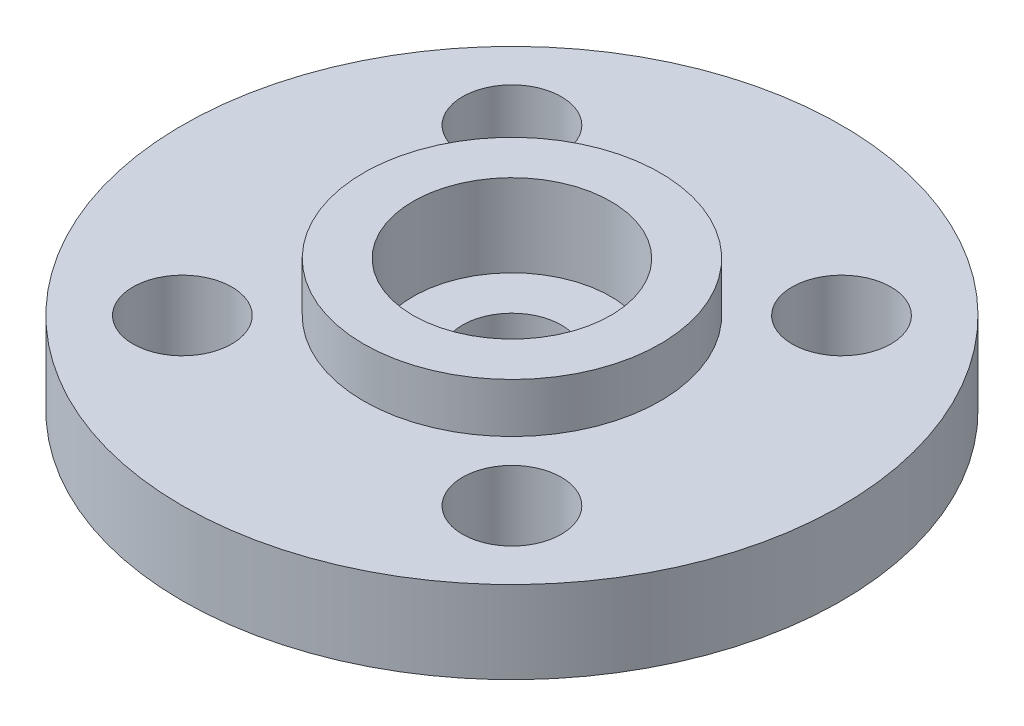
ISO-10303-21;
HEADER;
FILE_DESCRIPTION(('STEP AP214'),'2;1');
FILE_NAME('part.step','',(''),(''),'','','');
FILE_SCHEMA(('AUTOMOTIVE_DESIGN { 1 0 10303 214 1 1 1 1 }'));
ENDSEC;
DATA;
#1=APPLICATION_CONTEXT('core data for automotive mechanical design processes');
#2=APPLICATION_PROTOCOL_DEFINITION('international standard','automotive_design',2000,#1);
#3=PRODUCT_CONTEXT('',#1,'mechanical');
#4=PRODUCT('Part','Part','',(#3));
#5=PRODUCT_RELATED_PRODUCT_CATEGORY('part','',(#4));
#6=PRODUCT_DEFINITION_FORMATION('','',#4);
#7=PRODUCT_DEFINITION_CONTEXT('part definition',#1,'design');
#8=PRODUCT_DEFINITION('design','',#6,#7);
#9=PRODUCT_DEFINITION_SHAPE('','',#8);
#10=(LENGTH_UNIT() NAMED_UNIT(*) SI_UNIT(.MILLI.,.METRE.));
#11=(NAMED_UNIT(*) PLANE_ANGLE_UNIT() SI_UNIT($,.RADIAN.));
#12=(NAMED_UNIT(*) SI_UNIT($,.STERADIAN.) SOLID_ANGLE_UNIT());
#13=UNCERTAINTY_MEASURE_WITH_UNIT(LENGTH_MEASURE(1.E-05),#10,'distance_accuracy_value','');
#14=(GEOMETRIC_REPRESENTATION_CONTEXT(3) GLOBAL_UNCERTAINTY_ASSIGNED_CONTEXT((#13)) GLOBAL_UNIT_ASSIGNED_CONTEXT((#10,
#11,#12)) REPRESENTATION_CONTEXT('',''));
#15=CARTESIAN_POINT('',(0.,0.,0.));
#16=DIRECTION('',(0.,0.,1.));
#17=DIRECTION('',(1.,0.,0.));
#18=AXIS2_PLACEMENT_3D('',#15,#16,#17);
#19=CARTESIAN_POINT('',(0.,2.5,0.));
#20=DIRECTION('',(0.,1.,0.));
#21=DIRECTION('',(0.,0.,1.));
#22=AXIS2_PLACEMENT_3D('',#19,#20,#21);
#23=PLANE('',#22);
#24=CARTESIAN_POINT('',(0.,2.5,0.));
#25=DIRECTION('',(0.,1.,0.));
#26=DIRECTION('',(0.,0.,1.));
#27=AXIS2_PLACEMENT_3D('',#24,#25,#26);
#28=CIRCLE('',#27,10.);
#29=CARTESIAN_POINT('',(0.,2.5,10.));
#30=VERTEX_POINT('',#29);
#31=EDGE_CURVE('E11',#30,#30,#28,.T.);
#32=ORIENTED_EDGE('',*,*,#31,.T.);
#33=EDGE_LOOP('',(#32));
#34=FACE_BOUND('',#33,.T.);
#35=CARTESIAN_POINT('',(4.99999999999997,2.5,5.00000000000003));
#36=DIRECTION('',(0.,1.,0.));
#37=DIRECTION('',(0.,0.,1.));
#38=AXIS2_PLACEMENT_3D('',#35,#36,#37);
#39=CIRCLE('',#38,1.5);
#40=CARTESIAN_POINT('',(4.99999999999997,2.5,6.50000000000003));
#41=VERTEX_POINT('',#40);
#42=EDGE_CURVE('E58',#41,#41,#39,.T.);
#43=ORIENTED_EDGE('',*,*,#42,.F.);
#44=EDGE_LOOP('',(#43));
#45=FACE_BOUND('',#44,.T.);
#46=CARTESIAN_POINT('',(-5.00000000000005,2.5,4.99999999999995));
#47=DIRECTION('',(0.,1.,0.));
#48=DIRECTION('',(0.,0.,1.));
#49=AXIS2_PLACEMENT_3D('',#46,#47,#48);
#50=CIRCLE('',#49,1.5);
#51=CARTESIAN_POINT('',(-5.00000000000005,2.5,6.49999999999995));
#52=VERTEX_POINT('',#51);
#53=EDGE_CURVE('E64',#52,#52,#50,.T.);
#54=ORIENTED_EDGE('',*,*,#53,.F.);
#55=EDGE_LOOP('',(#54));
#56=FACE_BOUND('',#55,.T.);
#57=CARTESIAN_POINT('',(5.00000000000002,2.5,-4.99999999999999));
#58=DIRECTION('',(0.,1.,0.));
#59=DIRECTION('',(0.,0.,1.));
#60=AXIS2_PLACEMENT_3D('',#57,#58,#59);
#61=CIRCLE('',#60,1.5);
#62=CARTESIAN_POINT('',(5.00000000000002,2.5,-3.49999999999998));
#63=VERTEX_POINT('',#62);
#64=EDGE_CURVE('E92',#63,#63,#61,.T.);
#65=ORIENTED_EDGE('',*,*,#64,.F.);
#66=EDGE_LOOP('',(#65));
#67=FACE_BOUND('',#66,.T.);
#68=CARTESIAN_POINT('',(-5.,2.5,-5.));
#69=DIRECTION('',(0.,1.,0.));
#70=DIRECTION('',(0.,0.,1.));
#71=AXIS2_PLACEMENT_3D('',#68,#69,#70);
#72=CIRCLE('',#71,1.5);
#73=CARTESIAN_POINT('',(-5.,2.5,-3.5));
#74=VERTEX_POINT('',#73);
#75=EDGE_CURVE('E87',#74,#74,#72,.T.);
#76=ORIENTED_EDGE('',*,*,#75,.F.);
#77=EDGE_LOOP('',(#76));
#78=FACE_BOUND('',#77,.T.);
#79=CARTESIAN_POINT('',(0.,2.5,0.));
#80=DIRECTION('',(0.,1.,0.));
#81=DIRECTION('',(0.,0.,1.));
#82=AXIS2_PLACEMENT_3D('',#79,#80,#81);
#83=CIRCLE('',#82,4.5);
#84=CARTESIAN_POINT('',(0.,2.5,4.5));
#85=VERTEX_POINT('',#84);
#86=EDGE_CURVE('E117',#85,#85,#83,.T.);
#87=ORIENTED_EDGE('',*,*,#86,.F.);
#88=EDGE_LOOP('',(#87));
#89=FACE_BOUND('',#88,.T.);
#90=ADVANCED_FACE('F49',(#34,#45,#56,#67,#78,#89),#23,.T.);
#91=CARTESIAN_POINT('',(0.,2.5,0.));
#92=DIRECTION('',(0.,-1.,0.));
#93=DIRECTION('',(0.,0.,-1.));
#94=AXIS2_PLACEMENT_3D('',#91,#92,#93);
#95=CYLINDRICAL_SURFACE('',#94,10.);
#96=ORIENTED_EDGE('',*,*,#31,.F.);
#97=EDGE_LOOP('',(#96));
#98=FACE_BOUND('',#97,.T.);
#99=CARTESIAN_POINT('',(0.,0.,0.));
#100=DIRECTION('',(0.,1.,0.));
#101=DIRECTION('',(0.,0.,1.));
#102=AXIS2_PLACEMENT_3D('',#99,#100,#101);
#103=CIRCLE('',#102,10.);
#104=CARTESIAN_POINT('',(0.,0.,10.));
#105=VERTEX_POINT('',#104);
#106=EDGE_CURVE('E53',#105,#105,#103,.T.);
#107=ORIENTED_EDGE('',*,*,#106,.T.);
#108=EDGE_LOOP('',(#107));
#109=FACE_BOUND('',#108,.T.);
#110=ADVANCED_FACE('F110',(#98,#109),#95,.T.);
#111=CARTESIAN_POINT('',(4.99999999999997,2.5,5.00000000000003));
#112=DIRECTION('',(0.,-1.,0.));
#113=DIRECTION('',(0.,0.,-1.));
#114=AXIS2_PLACEMENT_3D('',#111,#112,#113);
#115=CYLINDRICAL_SURFACE('',#114,1.5);
#116=ORIENTED_EDGE('',*,*,#42,.T.);
#117=EDGE_LOOP('',(#116));
#118=FACE_BOUND('',#117,.T.);
#119=CARTESIAN_POINT('',(4.99999999999997,0.,5.00000000000003));
#120=DIRECTION('',(0.,1.,0.));
#121=DIRECTION('',(0.,0.,1.));
#122=AXIS2_PLACEMENT_3D('',#119,#120,#121);
#123=CIRCLE('',#122,1.5);
#124=CARTESIAN_POINT('',(4.99999999999997,0.,6.50000000000003));
#125=VERTEX_POINT('',#124);
#126=EDGE_CURVE('E80',#125,#125,#123,.T.);
#127=ORIENTED_EDGE('',*,*,#126,.F.);
#128=EDGE_LOOP('',(#127));
#129=FACE_BOUND('',#128,.T.);
#130=ADVANCED_FACE('F174',(#118,#129),#115,.F.);
#131=CARTESIAN_POINT('',(-5.00000000000005,2.5,4.99999999999995));
#132=DIRECTION('',(0.,-1.,0.));
#133=DIRECTION('',(0.,0.,-1.));
#134=AXIS2_PLACEMENT_3D('',#131,#132,#133);
#135=CYLINDRICAL_SURFACE('',#134,1.5);
#136=ORIENTED_EDGE('',*,*,#53,.T.);
#137=EDGE_LOOP('',(#136));
#138=FACE_BOUND('',#137,.T.);
#139=CARTESIAN_POINT('',(-5.00000000000005,0.,4.99999999999995));
#140=DIRECTION('',(0.,1.,0.));
#141=DIRECTION('',(0.,0.,1.));
#142=AXIS2_PLACEMENT_3D('',#139,#140,#141);
#143=CIRCLE('',#142,1.5);
#144=CARTESIAN_POINT('',(-5.00000000000005,0.,6.49999999999995));
#145=VERTEX_POINT('',#144);
#146=EDGE_CURVE('E77',#145,#145,#143,.T.);
#147=ORIENTED_EDGE('',*,*,#146,.F.);
#148=EDGE_LOOP('',(#147));
#149=FACE_BOUND('',#148,.T.);
#150=ADVANCED_FACE('F105',(#138,#149),#135,.F.);
#151=CARTESIAN_POINT('',(5.00000000000002,2.5,-4.99999999999999));
#152=DIRECTION('',(0.,-1.,0.));
#153=DIRECTION('',(0.,0.,-1.));
#154=AXIS2_PLACEMENT_3D('',#151,#152,#153);
#155=CYLINDRICAL_SURFACE('',#154,1.5);
#156=ORIENTED_EDGE('',*,*,#64,.T.);
#157=EDGE_LOOP('',(#156));
#158=FACE_BOUND('',#157,.T.);
#159=CARTESIAN_POINT('',(5.00000000000002,0.,-4.99999999999999));
#160=DIRECTION('',(0.,1.,0.));
#161=DIRECTION('',(0.,0.,1.));
#162=AXIS2_PLACEMENT_3D('',#159,#160,#161);
#163=CIRCLE('',#162,1.5);
#164=CARTESIAN_POINT('',(5.00000000000002,0.,-3.49999999999998));
#165=VERTEX_POINT('',#164);
#166=EDGE_CURVE('E72',#165,#165,#163,.T.);
#167=ORIENTED_EDGE('',*,*,#166,.F.);
#168=EDGE_LOOP('',(#167));
#169=FACE_BOUND('',#168,.T.);
#170=ADVANCED_FACE('F180',(#158,#169),#155,.F.);
#171=CARTESIAN_POINT('',(-5.,2.5,-5.));
#172=DIRECTION('',(0.,-1.,0.));
#173=DIRECTION('',(0.,0.,-1.));
#174=AXIS2_PLACEMENT_3D('',#171,#172,#173);
#175=CYLINDRICAL_SURFACE('',#174,1.5);
#176=ORIENTED_EDGE('',*,*,#75,.T.);
#177=EDGE_LOOP('',(#176));
#178=FACE_BOUND('',#177,.T.);
#179=CARTESIAN_POINT('',(-5.,0.,-5.));
#180=DIRECTION('',(0.,1.,0.));
#181=DIRECTION('',(0.,0.,1.));
#182=AXIS2_PLACEMENT_3D('',#179,#180,#181);
#183=CIRCLE('',#182,1.5);
#184=CARTESIAN_POINT('',(-5.,0.,-3.5));
#185=VERTEX_POINT('',#184);
#186=EDGE_CURVE('E68',#185,#185,#183,.T.);
#187=ORIENTED_EDGE('',*,*,#186,.F.);
#188=EDGE_LOOP('',(#187));
#189=FACE_BOUND('',#188,.T.);
#190=ADVANCED_FACE('F51',(#178,#189),#175,.F.);
#191=CARTESIAN_POINT('',(0.,0.,0.));
#192=DIRECTION('',(0.,1.,0.));
#193=DIRECTION('',(0.,0.,1.));
#194=AXIS2_PLACEMENT_3D('',#191,#192,#193);
#195=PLANE('',#194);
#196=CARTESIAN_POINT('',(0.,0.,0.));
#197=DIRECTION('',(0.,1.,0.));
#198=DIRECTION('',(0.,0.,1.));
#199=AXIS2_PLACEMENT_3D('',#196,#197,#198);
#200=CIRCLE('',#199,1.5);
#201=CARTESIAN_POINT('',(0.,0.,1.5));
#202=VERTEX_POINT('',#201);
#203=EDGE_CURVE('E131',#202,#202,#200,.T.);
#204=ORIENTED_EDGE('',*,*,#203,.T.);
#205=EDGE_LOOP('',(#204));
#206=FACE_BOUND('',#205,.T.);
#207=ORIENTED_EDGE('',*,*,#186,.T.);
#208=EDGE_LOOP('',(#207));
#209=FACE_BOUND('',#208,.T.);
#210=ORIENTED_EDGE('',*,*,#166,.T.);
#211=EDGE_LOOP('',(#210));
#212=FACE_BOUND('',#211,.T.);
#213=ORIENTED_EDGE('',*,*,#146,.T.);
#214=EDGE_LOOP('',(#213));
#215=FACE_BOUND('',#214,.T.);
#216=ORIENTED_EDGE('',*,*,#126,.T.);
#217=EDGE_LOOP('',(#216));
#218=FACE_BOUND('',#217,.T.);
#219=ORIENTED_EDGE('',*,*,#106,.F.);
#220=EDGE_LOOP('',(#219));
#221=FACE_BOUND('',#220,.T.);
#222=ADVANCED_FACE('F151',(#206,#209,#212,#215,#218,#221),#195,.F.);
#223=CARTESIAN_POINT('',(0.,1.5,0.));
#224=DIRECTION('',(0.,1.,0.));
#225=DIRECTION('',(0.,0.,1.));
#226=AXIS2_PLACEMENT_3D('',#223,#224,#225);
#227=CYLINDRICAL_SURFACE('',#226,3.);
#228=CARTESIAN_POINT('',(0.,1.5,0.));
#229=DIRECTION('',(0.,1.,0.));
#230=DIRECTION('',(0.,0.,1.));
#231=AXIS2_PLACEMENT_3D('',#228,#229,#230);
#232=CIRCLE('',#231,3.);
#233=CARTESIAN_POINT('',(0.,1.5,3.));
#234=VERTEX_POINT('',#233);
#235=EDGE_CURVE('E73',#234,#234,#232,.T.);
#236=ORIENTED_EDGE('',*,*,#235,.F.);
#237=EDGE_LOOP('',(#236));
#238=FACE_BOUND('',#237,.T.);
#239=CARTESIAN_POINT('',(0.,4.,0.));
#240=DIRECTION('',(0.,1.,0.));
#241=DIRECTION('',(0.,0.,1.));
#242=AXIS2_PLACEMENT_3D('',#239,#240,#241);
#243=CIRCLE('',#242,3.);
#244=CARTESIAN_POINT('',(0.,4.,3.));
#245=VERTEX_POINT('',#244);
#246=EDGE_CURVE('E121',#245,#245,#243,.T.);
#247=ORIENTED_EDGE('',*,*,#246,.T.);
#248=EDGE_LOOP('',(#247));
#249=FACE_BOUND('',#248,.T.);
#250=ADVANCED_FACE('F143',(#238,#249),#227,.F.);
#251=CARTESIAN_POINT('',(0.,1.5,0.));
#252=DIRECTION('',(0.,1.,0.));
#253=DIRECTION('',(0.,0.,1.));
#254=AXIS2_PLACEMENT_3D('',#251,#252,#253);
#255=PLANE('',#254);
#256=CARTESIAN_POINT('',(0.,1.5,0.));
#257=DIRECTION('',(0.,1.,0.));
#258=DIRECTION('',(0.,0.,1.));
#259=AXIS2_PLACEMENT_3D('',#256,#257,#258);
#260=CIRCLE('',#259,1.5);
#261=CARTESIAN_POINT('',(0.,1.5,1.5));
#262=VERTEX_POINT('',#261);
#263=EDGE_CURVE('E126',#262,#262,#260,.T.);
#264=ORIENTED_EDGE('',*,*,#263,.F.);
#265=EDGE_LOOP('',(#264));
#266=FACE_BOUND('',#265,.T.);
#267=ORIENTED_EDGE('',*,*,#235,.T.);
#268=EDGE_LOOP('',(#267));
#269=FACE_BOUND('',#268,.T.);
#270=ADVANCED_FACE('F140',(#266,#269),#255,.T.);
#271=CARTESIAN_POINT('',(0.,0.,0.));
#272=DIRECTION('',(0.,1.,0.));
#273=DIRECTION('',(0.,0.,1.));
#274=AXIS2_PLACEMENT_3D('',#271,#272,#273);
#275=CYLINDRICAL_SURFACE('',#274,1.5);
#276=ORIENTED_EDGE('',*,*,#203,.F.);
#277=EDGE_LOOP('',(#276));
#278=FACE_BOUND('',#277,.T.);
#279=ORIENTED_EDGE('',*,*,#263,.T.);
#280=EDGE_LOOP('',(#279));
#281=FACE_BOUND('',#280,.T.);
#282=ADVANCED_FACE('F138',(#278,#281),#275,.F.);
#283=CARTESIAN_POINT('',(0.,4.,0.));
#284=DIRECTION('',(0.,1.,0.));
#285=DIRECTION('',(0.,0.,1.));
#286=AXIS2_PLACEMENT_3D('',#283,#284,#285);
#287=PLANE('',#286);
#288=CARTESIAN_POINT('',(0.,4.,0.));
#289=DIRECTION('',(0.,1.,0.));
#290=DIRECTION('',(0.,0.,1.));
#291=AXIS2_PLACEMENT_3D('',#288,#289,#290);
#292=CIRCLE('',#291,4.5);
#293=CARTESIAN_POINT('',(0.,4.,4.5));
#294=VERTEX_POINT('',#293);
#295=EDGE_CURVE('E120',#294,#294,#292,.T.);
#296=ORIENTED_EDGE('',*,*,#295,.T.);
#297=EDGE_LOOP('',(#296));
#298=FACE_BOUND('',#297,.T.);
#299=ORIENTED_EDGE('',*,*,#246,.F.);
#300=EDGE_LOOP('',(#299));
#301=FACE_BOUND('',#300,.T.);
#302=ADVANCED_FACE('F155',(#298,#301),#287,.T.);
#303=CARTESIAN_POINT('',(0.,4.,0.));
#304=DIRECTION('',(0.,-1.,0.));
#305=DIRECTION('',(0.,0.,-1.));
#306=AXIS2_PLACEMENT_3D('',#303,#304,#305);
#307=CYLINDRICAL_SURFACE('',#306,4.5);
#308=ORIENTED_EDGE('',*,*,#295,.F.);
#309=EDGE_LOOP('',(#308));
#310=FACE_BOUND('',#309,.T.);
#311=ORIENTED_EDGE('',*,*,#86,.T.);
#312=EDGE_LOOP('',(#311));
#313=FACE_BOUND('',#312,.T.);
#314=ADVANCED_FACE('F157',(#310,#313),#307,.T.);
#315=CLOSED_SHELL('',(#90,#110,#130,#150,#170,#190,#222,#250,#270,#282,#302,#314));
#316=MANIFOLD_SOLID_BREP('B2',#315);
#317=ADVANCED_BREP_SHAPE_REPRESENTATION('',(#18,#316),#14);
#318=SHAPE_DEFINITION_REPRESENTATION(#9,#317);
ENDSEC;
END-ISO-10303-21;
